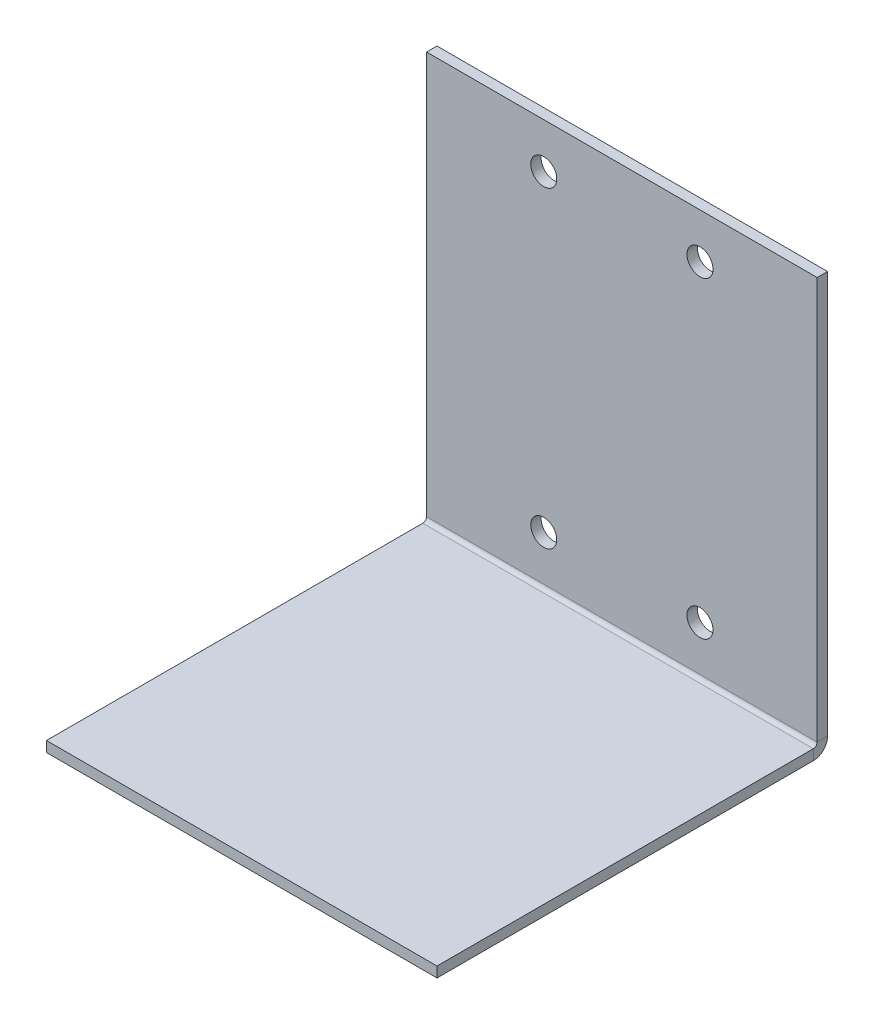
ISO-10303-21;
HEADER;
FILE_DESCRIPTION(('STEP AP214'),'2;1');
FILE_NAME('part.step','',(''),(''),'','','');
FILE_SCHEMA(('AUTOMOTIVE_DESIGN { 1 0 10303 214 1 1 1 1 }'));
ENDSEC;
DATA;
#1=APPLICATION_CONTEXT('core data for automotive mechanical design processes');
#2=APPLICATION_PROTOCOL_DEFINITION('international standard','automotive_design',2000,#1);
#3=PRODUCT_CONTEXT('',#1,'mechanical');
#4=PRODUCT('Part','Part','',(#3));
#5=PRODUCT_RELATED_PRODUCT_CATEGORY('part','',(#4));
#6=PRODUCT_DEFINITION_FORMATION('','',#4);
#7=PRODUCT_DEFINITION_CONTEXT('part definition',#1,'design');
#8=PRODUCT_DEFINITION('design','',#6,#7);
#9=PRODUCT_DEFINITION_SHAPE('','',#8);
#10=(LENGTH_UNIT() NAMED_UNIT(*) SI_UNIT(.MILLI.,.METRE.));
#11=(NAMED_UNIT(*) PLANE_ANGLE_UNIT() SI_UNIT($,.RADIAN.));
#12=(NAMED_UNIT(*) SI_UNIT($,.STERADIAN.) SOLID_ANGLE_UNIT());
#13=UNCERTAINTY_MEASURE_WITH_UNIT(LENGTH_MEASURE(1.E-05),#10,'distance_accuracy_value','');
#14=(GEOMETRIC_REPRESENTATION_CONTEXT(3) GLOBAL_UNCERTAINTY_ASSIGNED_CONTEXT((#13)) GLOBAL_UNIT_ASSIGNED_CONTEXT((#10,
#11,#12)) REPRESENTATION_CONTEXT('',''));
#15=CARTESIAN_POINT('',(0.,0.,0.));
#16=DIRECTION('',(0.,0.,1.));
#17=DIRECTION('',(1.,0.,0.));
#18=AXIS2_PLACEMENT_3D('',#15,#16,#17);
#19=CARTESIAN_POINT('',(75.,0.,-2.));
#20=DIRECTION('',(1.,0.,0.));
#21=DIRECTION('',(0.,0.,-1.));
#22=AXIS2_PLACEMENT_3D('',#19,#20,#21);
#23=PLANE('',#22);
#24=DIRECTION('',(0.,1.,0.));
#25=VECTOR('',#24,1.);
#26=CARTESIAN_POINT('',(75.,0.,0.));
#27=LINE('',#26,#25);
#28=CARTESIAN_POINT('',(75.,2.7366,0.));
#29=VERTEX_POINT('',#28);
#30=CARTESIAN_POINT('',(75.,80.,0.));
#31=VERTEX_POINT('',#30);
#32=EDGE_CURVE('E107',#29,#31,#27,.T.);
#33=ORIENTED_EDGE('',*,*,#32,.F.);
#34=DIRECTION('',(0.,0.,-1.));
#35=VECTOR('',#34,1.);
#36=CARTESIAN_POINT('',(75.,2.7366,0.));
#37=LINE('',#36,#35);
#38=CARTESIAN_POINT('',(75.,2.7366,-2.));
#39=VERTEX_POINT('',#38);
#40=EDGE_CURVE('E120',#29,#39,#37,.T.);
#41=ORIENTED_EDGE('',*,*,#40,.T.);
#42=DIRECTION('',(0.,1.,0.));
#43=VECTOR('',#42,1.);
#44=CARTESIAN_POINT('',(75.,0.,-2.));
#45=LINE('',#44,#43);
#46=CARTESIAN_POINT('',(75.,80.,-2.));
#47=VERTEX_POINT('',#46);
#48=EDGE_CURVE('E114',#39,#47,#45,.T.);
#49=ORIENTED_EDGE('',*,*,#48,.T.);
#50=DIRECTION('',(0.,0.,1.));
#51=VECTOR('',#50,1.);
#52=CARTESIAN_POINT('',(75.,80.,-2.));
#53=LINE('',#52,#51);
#54=EDGE_CURVE('E63',#47,#31,#53,.T.);
#55=ORIENTED_EDGE('',*,*,#54,.T.);
#56=EDGE_LOOP('',(#33,#41,#49,#55));
#57=FACE_BOUND('',#56,.T.);
#58=ADVANCED_FACE('F59',(#57),#23,.T.);
#59=CARTESIAN_POINT('',(0.,0.,-2.));
#60=DIRECTION('',(0.,0.,-1.));
#61=DIRECTION('',(-1.,0.,0.));
#62=AXIS2_PLACEMENT_3D('',#59,#60,#61);
#63=PLANE('',#62);
#64=CARTESIAN_POINT('',(22.5,71.3666,-2.));
#65=DIRECTION('',(0.,0.,-1.));
#66=DIRECTION('',(1.,0.,0.));
#67=AXIS2_PLACEMENT_3D('',#64,#65,#66);
#68=CIRCLE('',#67,2.5);
#69=CARTESIAN_POINT('',(25.,71.3666,-2.));
#70=VERTEX_POINT('',#69);
#71=EDGE_CURVE('E196',#70,#70,#68,.T.);
#72=ORIENTED_EDGE('',*,*,#71,.F.);
#73=EDGE_LOOP('',(#72));
#74=FACE_BOUND('',#73,.T.);
#75=CARTESIAN_POINT('',(52.4999999999999,11.3666,-2.));
#76=DIRECTION('',(0.,0.,-1.));
#77=DIRECTION('',(1.,0.,0.));
#78=AXIS2_PLACEMENT_3D('',#75,#76,#77);
#79=CIRCLE('',#78,2.49999999999999);
#80=CARTESIAN_POINT('',(54.9999999999999,11.3666,-2.));
#81=VERTEX_POINT('',#80);
#82=EDGE_CURVE('E190',#81,#81,#79,.T.);
#83=ORIENTED_EDGE('',*,*,#82,.F.);
#84=EDGE_LOOP('',(#83));
#85=FACE_BOUND('',#84,.T.);
#86=CARTESIAN_POINT('',(52.4999999999999,71.37,-2.));
#87=DIRECTION('',(0.,0.,-1.));
#88=DIRECTION('',(-1.,0.,0.));
#89=AXIS2_PLACEMENT_3D('',#86,#87,#88);
#90=CIRCLE('',#89,2.5);
#91=CARTESIAN_POINT('',(50.,71.37,-2.));
#92=VERTEX_POINT('',#91);
#93=EDGE_CURVE('E184',#92,#92,#90,.T.);
#94=ORIENTED_EDGE('',*,*,#93,.F.);
#95=EDGE_LOOP('',(#94));
#96=FACE_BOUND('',#95,.T.);
#97=CARTESIAN_POINT('',(22.5,11.37,-2.));
#98=DIRECTION('',(0.,0.,-1.));
#99=DIRECTION('',(-1.,0.,0.));
#100=AXIS2_PLACEMENT_3D('',#97,#98,#99);
#101=CIRCLE('',#100,2.5);
#102=CARTESIAN_POINT('',(20.,11.37,-2.));
#103=VERTEX_POINT('',#102);
#104=EDGE_CURVE('E178',#103,#103,#101,.T.);
#105=ORIENTED_EDGE('',*,*,#104,.F.);
#106=EDGE_LOOP('',(#105));
#107=FACE_BOUND('',#106,.T.);
#108=ORIENTED_EDGE('',*,*,#48,.F.);
#109=DIRECTION('',(1.,0.,0.));
#110=VECTOR('',#109,1.);
#111=CARTESIAN_POINT('',(75.,2.7366,-2.));
#112=LINE('',#111,#110);
#113=CARTESIAN_POINT('',(0.,2.73660000000001,-2.));
#114=VERTEX_POINT('',#113);
#115=EDGE_CURVE('E137',#39,#114,#112,.F.);
#116=ORIENTED_EDGE('',*,*,#115,.T.);
#117=DIRECTION('',(0.,-1.,0.));
#118=VECTOR('',#117,1.);
#119=CARTESIAN_POINT('',(0.,0.,-2.));
#120=LINE('',#119,#118);
#121=CARTESIAN_POINT('',(0.,80.,-2.));
#122=VERTEX_POINT('',#121);
#123=EDGE_CURVE('E112',#122,#114,#120,.T.);
#124=ORIENTED_EDGE('',*,*,#123,.F.);
#125=DIRECTION('',(-1.,0.,0.));
#126=VECTOR('',#125,1.);
#127=CARTESIAN_POINT('',(0.,80.,-2.));
#128=LINE('',#127,#126);
#129=EDGE_CURVE('E99',#47,#122,#128,.T.);
#130=ORIENTED_EDGE('',*,*,#129,.F.);
#131=EDGE_LOOP('',(#108,#116,#124,#130));
#132=FACE_BOUND('',#131,.T.);
#133=ADVANCED_FACE('F203',(#74,#85,#96,#107,#132),#63,.T.);
#134=CARTESIAN_POINT('',(0.,0.,0.));
#135=DIRECTION('',(0.,0.,-1.));
#136=DIRECTION('',(-1.,0.,0.));
#137=AXIS2_PLACEMENT_3D('',#134,#135,#136);
#138=PLANE('',#137);
#139=CARTESIAN_POINT('',(22.5,71.3666,0.));
#140=DIRECTION('',(0.,0.,-1.));
#141=DIRECTION('',(-1.,0.,0.));
#142=AXIS2_PLACEMENT_3D('',#139,#140,#141);
#143=CIRCLE('',#142,2.5);
#144=CARTESIAN_POINT('',(20.,71.3666,0.));
#145=VERTEX_POINT('',#144);
#146=EDGE_CURVE('E193',#145,#145,#143,.F.);
#147=ORIENTED_EDGE('',*,*,#146,.F.);
#148=EDGE_LOOP('',(#147));
#149=FACE_BOUND('',#148,.T.);
#150=CARTESIAN_POINT('',(52.4999999999999,11.3666,0.));
#151=DIRECTION('',(0.,0.,-1.));
#152=DIRECTION('',(-1.,0.,0.));
#153=AXIS2_PLACEMENT_3D('',#150,#151,#152);
#154=CIRCLE('',#153,2.49999999999999);
#155=CARTESIAN_POINT('',(50.,11.3666,0.));
#156=VERTEX_POINT('',#155);
#157=EDGE_CURVE('E187',#156,#156,#154,.F.);
#158=ORIENTED_EDGE('',*,*,#157,.F.);
#159=EDGE_LOOP('',(#158));
#160=FACE_BOUND('',#159,.T.);
#161=CARTESIAN_POINT('',(52.4999999999999,71.37,0.));
#162=DIRECTION('',(0.,0.,-1.));
#163=DIRECTION('',(-1.,0.,0.));
#164=AXIS2_PLACEMENT_3D('',#161,#162,#163);
#165=CIRCLE('',#164,2.5);
#166=CARTESIAN_POINT('',(50.,71.37,0.));
#167=VERTEX_POINT('',#166);
#168=EDGE_CURVE('E181',#167,#167,#165,.F.);
#169=ORIENTED_EDGE('',*,*,#168,.F.);
#170=EDGE_LOOP('',(#169));
#171=FACE_BOUND('',#170,.T.);
#172=CARTESIAN_POINT('',(22.5,11.37,0.));
#173=DIRECTION('',(0.,0.,-1.));
#174=DIRECTION('',(-1.,0.,0.));
#175=AXIS2_PLACEMENT_3D('',#172,#173,#174);
#176=CIRCLE('',#175,2.5);
#177=CARTESIAN_POINT('',(20.,11.37,0.));
#178=VERTEX_POINT('',#177);
#179=EDGE_CURVE('E145',#178,#178,#176,.F.);
#180=ORIENTED_EDGE('',*,*,#179,.F.);
#181=EDGE_LOOP('',(#180));
#182=FACE_BOUND('',#181,.T.);
#183=DIRECTION('',(1.,0.,0.));
#184=VECTOR('',#183,1.);
#185=CARTESIAN_POINT('',(75.,2.7366,0.));
#186=LINE('',#185,#184);
#187=CARTESIAN_POINT('',(0.,2.7366,0.));
#188=VERTEX_POINT('',#187);
#189=EDGE_CURVE('E127',#29,#188,#186,.F.);
#190=ORIENTED_EDGE('',*,*,#189,.F.);
#191=ORIENTED_EDGE('',*,*,#32,.T.);
#192=DIRECTION('',(-1.,0.,0.));
#193=VECTOR('',#192,1.);
#194=CARTESIAN_POINT('',(0.,80.,0.));
#195=LINE('',#194,#193);
#196=CARTESIAN_POINT('',(0.,80.,0.));
#197=VERTEX_POINT('',#196);
#198=EDGE_CURVE('E97',#31,#197,#195,.T.);
#199=ORIENTED_EDGE('',*,*,#198,.T.);
#200=DIRECTION('',(0.,-1.,0.));
#201=VECTOR('',#200,1.);
#202=CARTESIAN_POINT('',(0.,0.,0.));
#203=LINE('',#202,#201);
#204=EDGE_CURVE('E102',#197,#188,#203,.T.);
#205=ORIENTED_EDGE('',*,*,#204,.T.);
#206=EDGE_LOOP('',(#190,#191,#199,#205));
#207=FACE_BOUND('',#206,.T.);
#208=ADVANCED_FACE('F109',(#149,#160,#171,#182,#207),#138,.F.);
#209=CARTESIAN_POINT('',(0.,0.,-2.));
#210=DIRECTION('',(-1.,0.,0.));
#211=DIRECTION('',(0.,0.,1.));
#212=AXIS2_PLACEMENT_3D('',#209,#210,#211);
#213=PLANE('',#212);
#214=DIRECTION('',(0.,0.,-1.));
#215=VECTOR('',#214,1.);
#216=CARTESIAN_POINT('',(0.,2.7366,0.));
#217=LINE('',#216,#215);
#218=EDGE_CURVE('E104',#188,#114,#217,.T.);
#219=ORIENTED_EDGE('',*,*,#218,.F.);
#220=ORIENTED_EDGE('',*,*,#204,.F.);
#221=DIRECTION('',(0.,0.,1.));
#222=VECTOR('',#221,1.);
#223=CARTESIAN_POINT('',(0.,80.,-2.));
#224=LINE('',#223,#222);
#225=EDGE_CURVE('E13',#122,#197,#224,.T.);
#226=ORIENTED_EDGE('',*,*,#225,.F.);
#227=ORIENTED_EDGE('',*,*,#123,.T.);
#228=EDGE_LOOP('',(#219,#220,#226,#227));
#229=FACE_BOUND('',#228,.T.);
#230=ADVANCED_FACE('F61',(#229),#213,.T.);
#231=CARTESIAN_POINT('',(0.,80.,-2.));
#232=DIRECTION('',(0.,1.,0.));
#233=DIRECTION('',(0.,0.,1.));
#234=AXIS2_PLACEMENT_3D('',#231,#232,#233);
#235=PLANE('',#234);
#236=ORIENTED_EDGE('',*,*,#198,.F.);
#237=ORIENTED_EDGE('',*,*,#54,.F.);
#238=ORIENTED_EDGE('',*,*,#129,.T.);
#239=ORIENTED_EDGE('',*,*,#225,.T.);
#240=EDGE_LOOP('',(#236,#237,#238,#239));
#241=FACE_BOUND('',#240,.T.);
#242=ADVANCED_FACE('F94',(#241),#235,.T.);
#243=CARTESIAN_POINT('',(0.,2.7366,0.7366));
#244=DIRECTION('',(-1.,0.,0.));
#245=DIRECTION('',(0.,0.,1.));
#246=AXIS2_PLACEMENT_3D('',#243,#244,#245);
#247=PLANE('',#246);
#248=DIRECTION('',(0.,1.,0.));
#249=VECTOR('',#248,1.);
#250=CARTESIAN_POINT('',(0.,0.,0.73659999999999));
#251=LINE('',#250,#249);
#252=CARTESIAN_POINT('',(0.,2.,0.736599999999997));
#253=VERTEX_POINT('',#252);
#254=CARTESIAN_POINT('',(0.,0.,0.73659999999999));
#255=VERTEX_POINT('',#254);
#256=EDGE_CURVE('E141',#253,#255,#251,.F.);
#257=ORIENTED_EDGE('',*,*,#256,.F.);
#258=CARTESIAN_POINT('',(0.,2.7366,0.7366));
#259=DIRECTION('',(1.,0.,0.));
#260=DIRECTION('',(0.,0.,-1.));
#261=AXIS2_PLACEMENT_3D('',#258,#259,#260);
#262=CIRCLE('',#261,0.7366);
#263=EDGE_CURVE('E131',#188,#253,#262,.F.);
#264=ORIENTED_EDGE('',*,*,#263,.F.);
#265=ORIENTED_EDGE('',*,*,#218,.T.);
#266=CARTESIAN_POINT('',(0.,2.7366,0.7366));
#267=DIRECTION('',(1.,0.,0.));
#268=DIRECTION('',(0.,0.,-1.));
#269=AXIS2_PLACEMENT_3D('',#266,#267,#268);
#270=CIRCLE('',#269,2.7366);
#271=EDGE_CURVE('E74',#114,#255,#270,.F.);
#272=ORIENTED_EDGE('',*,*,#271,.T.);
#273=EDGE_LOOP('',(#257,#264,#265,#272));
#274=FACE_BOUND('',#273,.T.);
#275=ADVANCED_FACE('F262',(#274),#247,.T.);
#276=CARTESIAN_POINT('',(75.,2.7366,0.7366));
#277=DIRECTION('',(-1.,0.,0.));
#278=DIRECTION('',(0.,0.,1.));
#279=AXIS2_PLACEMENT_3D('',#276,#277,#278);
#280=PLANE('',#279);
#281=CARTESIAN_POINT('',(75.,2.7366,0.7366));
#282=DIRECTION('',(1.,0.,0.));
#283=DIRECTION('',(0.,0.,-1.));
#284=AXIS2_PLACEMENT_3D('',#281,#282,#283);
#285=CIRCLE('',#284,0.7366);
#286=CARTESIAN_POINT('',(75.,2.,0.736599999999997));
#287=VERTEX_POINT('',#286);
#288=EDGE_CURVE('E124',#287,#29,#285,.T.);
#289=ORIENTED_EDGE('',*,*,#288,.F.);
#290=DIRECTION('',(0.,1.,0.));
#291=VECTOR('',#290,1.);
#292=CARTESIAN_POINT('',(75.,2.,0.736599999999997));
#293=LINE('',#292,#291);
#294=CARTESIAN_POINT('',(75.,0.,0.73659999999999));
#295=VERTEX_POINT('',#294);
#296=EDGE_CURVE('E148',#287,#295,#293,.F.);
#297=ORIENTED_EDGE('',*,*,#296,.T.);
#298=CARTESIAN_POINT('',(75.,2.7366,0.7366));
#299=DIRECTION('',(1.,0.,0.));
#300=DIRECTION('',(0.,0.,-1.));
#301=AXIS2_PLACEMENT_3D('',#298,#299,#300);
#302=CIRCLE('',#301,2.7366);
#303=EDGE_CURVE('E134',#295,#39,#302,.T.);
#304=ORIENTED_EDGE('',*,*,#303,.T.);
#305=ORIENTED_EDGE('',*,*,#40,.F.);
#306=EDGE_LOOP('',(#289,#297,#304,#305));
#307=FACE_BOUND('',#306,.T.);
#308=ADVANCED_FACE('F221',(#307),#280,.F.);
#309=CARTESIAN_POINT('',(75.,2.7366,0.7366));
#310=DIRECTION('',(1.,0.,0.));
#311=DIRECTION('',(0.,-1.,0.));
#312=AXIS2_PLACEMENT_3D('',#309,#310,#311);
#313=CYLINDRICAL_SURFACE('',#312,2.7366);
#314=ORIENTED_EDGE('',*,*,#115,.F.);
#315=ORIENTED_EDGE('',*,*,#303,.F.);
#316=DIRECTION('',(1.,0.,0.));
#317=VECTOR('',#316,1.);
#318=CARTESIAN_POINT('',(0.,0.,0.73659999999999));
#319=LINE('',#318,#317);
#320=EDGE_CURVE('E151',#295,#255,#319,.F.);
#321=ORIENTED_EDGE('',*,*,#320,.T.);
#322=ORIENTED_EDGE('',*,*,#271,.F.);
#323=EDGE_LOOP('',(#314,#315,#321,#322));
#324=FACE_BOUND('',#323,.T.);
#325=ADVANCED_FACE('F259',(#324),#313,.T.);
#326=CARTESIAN_POINT('',(75.,2.7366,0.7366));
#327=DIRECTION('',(1.,0.,0.));
#328=DIRECTION('',(0.,-1.,0.));
#329=AXIS2_PLACEMENT_3D('',#326,#327,#328);
#330=CYLINDRICAL_SURFACE('',#329,0.7366);
#331=ORIENTED_EDGE('',*,*,#189,.T.);
#332=ORIENTED_EDGE('',*,*,#263,.T.);
#333=DIRECTION('',(1.,0.,0.));
#334=VECTOR('',#333,1.);
#335=CARTESIAN_POINT('',(0.,2.,0.736599999999997));
#336=LINE('',#335,#334);
#337=EDGE_CURVE('E144',#253,#287,#336,.T.);
#338=ORIENTED_EDGE('',*,*,#337,.T.);
#339=ORIENTED_EDGE('',*,*,#288,.T.);
#340=EDGE_LOOP('',(#331,#332,#338,#339));
#341=FACE_BOUND('',#340,.T.);
#342=ADVANCED_FACE('F227',(#341),#330,.F.);
#343=CARTESIAN_POINT('',(0.,0.,0.));
#344=DIRECTION('',(1.,0.,0.));
#345=DIRECTION('',(0.,0.,-1.));
#346=AXIS2_PLACEMENT_3D('',#343,#344,#345);
#347=PLANE('',#346);
#348=ORIENTED_EDGE('',*,*,#256,.T.);
#349=DIRECTION('',(0.,0.,-1.));
#350=VECTOR('',#349,1.);
#351=CARTESIAN_POINT('',(0.,0.,0.));
#352=LINE('',#351,#350);
#353=CARTESIAN_POINT('',(0.,-2.54878137735549E-13,73.));
#354=VERTEX_POINT('',#353);
#355=EDGE_CURVE('E162',#354,#255,#352,.T.);
#356=ORIENTED_EDGE('',*,*,#355,.F.);
#357=DIRECTION('',(0.,1.,0.));
#358=VECTOR('',#357,1.);
#359=CARTESIAN_POINT('',(0.,-2.54878137735549E-13,73.));
#360=LINE('',#359,#358);
#361=CARTESIAN_POINT('',(0.,1.99999999999975,73.));
#362=VERTEX_POINT('',#361);
#363=EDGE_CURVE('E171',#354,#362,#360,.T.);
#364=ORIENTED_EDGE('',*,*,#363,.T.);
#365=DIRECTION('',(0.,0.,1.));
#366=VECTOR('',#365,1.);
#367=CARTESIAN_POINT('',(0.,2.,0.));
#368=LINE('',#367,#366);
#369=EDGE_CURVE('E153',#362,#253,#368,.F.);
#370=ORIENTED_EDGE('',*,*,#369,.T.);
#371=EDGE_LOOP('',(#348,#356,#364,#370));
#372=FACE_BOUND('',#371,.T.);
#373=ADVANCED_FACE('F241',(#372),#347,.F.);
#374=CARTESIAN_POINT('',(75.,-2.55004350968591E-13,73.));
#375=DIRECTION('',(-1.,0.,0.));
#376=DIRECTION('',(0.,0.,1.));
#377=AXIS2_PLACEMENT_3D('',#374,#375,#376);
#378=PLANE('',#377);
#379=ORIENTED_EDGE('',*,*,#296,.F.);
#380=DIRECTION('',(0.,0.,-1.));
#381=VECTOR('',#380,1.);
#382=CARTESIAN_POINT('',(75.,1.99999999999975,73.));
#383=LINE('',#382,#381);
#384=CARTESIAN_POINT('',(75.,1.99999999999975,73.));
#385=VERTEX_POINT('',#384);
#386=EDGE_CURVE('E156',#287,#385,#383,.F.);
#387=ORIENTED_EDGE('',*,*,#386,.T.);
#388=DIRECTION('',(0.,1.,0.));
#389=VECTOR('',#388,1.);
#390=CARTESIAN_POINT('',(75.,-2.55004350968591E-13,73.));
#391=LINE('',#390,#389);
#392=CARTESIAN_POINT('',(75.,-2.54878137735549E-13,73.));
#393=VERTEX_POINT('',#392);
#394=EDGE_CURVE('E128',#393,#385,#391,.T.);
#395=ORIENTED_EDGE('',*,*,#394,.F.);
#396=DIRECTION('',(0.,0.,1.));
#397=VECTOR('',#396,1.);
#398=CARTESIAN_POINT('',(75.,0.,0.));
#399=LINE('',#398,#397);
#400=EDGE_CURVE('E165',#295,#393,#399,.T.);
#401=ORIENTED_EDGE('',*,*,#400,.F.);
#402=EDGE_LOOP('',(#379,#387,#395,#401));
#403=FACE_BOUND('',#402,.T.);
#404=ADVANCED_FACE('F307',(#403),#378,.F.);
#405=CARTESIAN_POINT('',(0.,0.,0.));
#406=DIRECTION('',(0.,1.,0.));
#407=DIRECTION('',(0.,0.,1.));
#408=AXIS2_PLACEMENT_3D('',#405,#406,#407);
#409=PLANE('',#408);
#410=ORIENTED_EDGE('',*,*,#320,.F.);
#411=ORIENTED_EDGE('',*,*,#400,.T.);
#412=DIRECTION('',(-1.,0.,0.));
#413=VECTOR('',#412,1.);
#414=CARTESIAN_POINT('',(0.,-2.54878137735549E-13,73.));
#415=LINE('',#414,#413);
#416=EDGE_CURVE('E168',#393,#354,#415,.T.);
#417=ORIENTED_EDGE('',*,*,#416,.T.);
#418=ORIENTED_EDGE('',*,*,#355,.T.);
#419=EDGE_LOOP('',(#410,#411,#417,#418));
#420=FACE_BOUND('',#419,.T.);
#421=ADVANCED_FACE('F304',(#420),#409,.F.);
#422=CARTESIAN_POINT('',(0.,2.,0.));
#423=DIRECTION('',(0.,1.,0.));
#424=DIRECTION('',(0.,0.,1.));
#425=AXIS2_PLACEMENT_3D('',#422,#423,#424);
#426=PLANE('',#425);
#427=ORIENTED_EDGE('',*,*,#386,.F.);
#428=ORIENTED_EDGE('',*,*,#337,.F.);
#429=ORIENTED_EDGE('',*,*,#369,.F.);
#430=DIRECTION('',(1.,0.,0.));
#431=VECTOR('',#430,1.);
#432=CARTESIAN_POINT('',(0.,1.99999999999975,73.));
#433=LINE('',#432,#431);
#434=EDGE_CURVE('E159',#385,#362,#433,.F.);
#435=ORIENTED_EDGE('',*,*,#434,.F.);
#436=EDGE_LOOP('',(#427,#428,#429,#435));
#437=FACE_BOUND('',#436,.T.);
#438=ADVANCED_FACE('F234',(#437),#426,.T.);
#439=CARTESIAN_POINT('',(0.,-2.55004350968591E-13,73.));
#440=DIRECTION('',(0.,0.,-1.));
#441=DIRECTION('',(0.,1.,0.));
#442=AXIS2_PLACEMENT_3D('',#439,#440,#441);
#443=PLANE('',#442);
#444=ORIENTED_EDGE('',*,*,#434,.T.);
#445=ORIENTED_EDGE('',*,*,#363,.F.);
#446=ORIENTED_EDGE('',*,*,#416,.F.);
#447=ORIENTED_EDGE('',*,*,#394,.T.);
#448=EDGE_LOOP('',(#444,#445,#446,#447));
#449=FACE_BOUND('',#448,.T.);
#450=ADVANCED_FACE('F249',(#449),#443,.F.);
#451=CARTESIAN_POINT('',(22.5,11.37,73.001));
#452=DIRECTION('',(0.,0.,-1.));
#453=DIRECTION('',(-1.,0.,0.));
#454=AXIS2_PLACEMENT_3D('',#451,#452,#453);
#455=CYLINDRICAL_SURFACE('',#454,2.5);
#456=ORIENTED_EDGE('',*,*,#104,.T.);
#457=EDGE_LOOP('',(#456));
#458=FACE_BOUND('',#457,.T.);
#459=ORIENTED_EDGE('',*,*,#179,.T.);
#460=EDGE_LOOP('',(#459));
#461=FACE_BOUND('',#460,.T.);
#462=ADVANCED_FACE('F289',(#458,#461),#455,.F.);
#463=CARTESIAN_POINT('',(52.4999999999999,71.37,73.001));
#464=DIRECTION('',(0.,0.,-1.));
#465=DIRECTION('',(-1.,0.,0.));
#466=AXIS2_PLACEMENT_3D('',#463,#464,#465);
#467=CYLINDRICAL_SURFACE('',#466,2.5);
#468=ORIENTED_EDGE('',*,*,#93,.T.);
#469=EDGE_LOOP('',(#468));
#470=FACE_BOUND('',#469,.T.);
#471=ORIENTED_EDGE('',*,*,#168,.T.);
#472=EDGE_LOOP('',(#471));
#473=FACE_BOUND('',#472,.T.);
#474=ADVANCED_FACE('F291',(#470,#473),#467,.F.);
#475=CARTESIAN_POINT('',(52.4999999999999,11.3666,73.001));
#476=DIRECTION('',(0.,0.,-1.));
#477=DIRECTION('',(-1.,0.,0.));
#478=AXIS2_PLACEMENT_3D('',#475,#476,#477);
#479=CYLINDRICAL_SURFACE('',#478,2.49999999999999);
#480=ORIENTED_EDGE('',*,*,#82,.T.);
#481=EDGE_LOOP('',(#480));
#482=FACE_BOUND('',#481,.T.);
#483=ORIENTED_EDGE('',*,*,#157,.T.);
#484=EDGE_LOOP('',(#483));
#485=FACE_BOUND('',#484,.T.);
#486=ADVANCED_FACE('F298',(#482,#485),#479,.F.);
#487=CARTESIAN_POINT('',(22.5,71.3666,73.001));
#488=DIRECTION('',(0.,0.,-1.));
#489=DIRECTION('',(-1.,0.,0.));
#490=AXIS2_PLACEMENT_3D('',#487,#488,#489);
#491=CYLINDRICAL_SURFACE('',#490,2.5);
#492=ORIENTED_EDGE('',*,*,#71,.T.);
#493=EDGE_LOOP('',(#492));
#494=FACE_BOUND('',#493,.T.);
#495=ORIENTED_EDGE('',*,*,#146,.T.);
#496=EDGE_LOOP('',(#495));
#497=FACE_BOUND('',#496,.T.);
#498=ADVANCED_FACE('F200',(#494,#497),#491,.F.);
#499=CLOSED_SHELL('',(#58,#133,#208,#230,#242,#275,#308,#325,#342,#373,#404,#421,#438,#450,#462,
#474,#486,#498));
#500=MANIFOLD_SOLID_BREP('B2',#499);
#501=ADVANCED_BREP_SHAPE_REPRESENTATION('',(#18,#500),#14);
#502=SHAPE_DEFINITION_REPRESENTATION(#9,#501);
ENDSEC;
END-ISO-10303-21;
